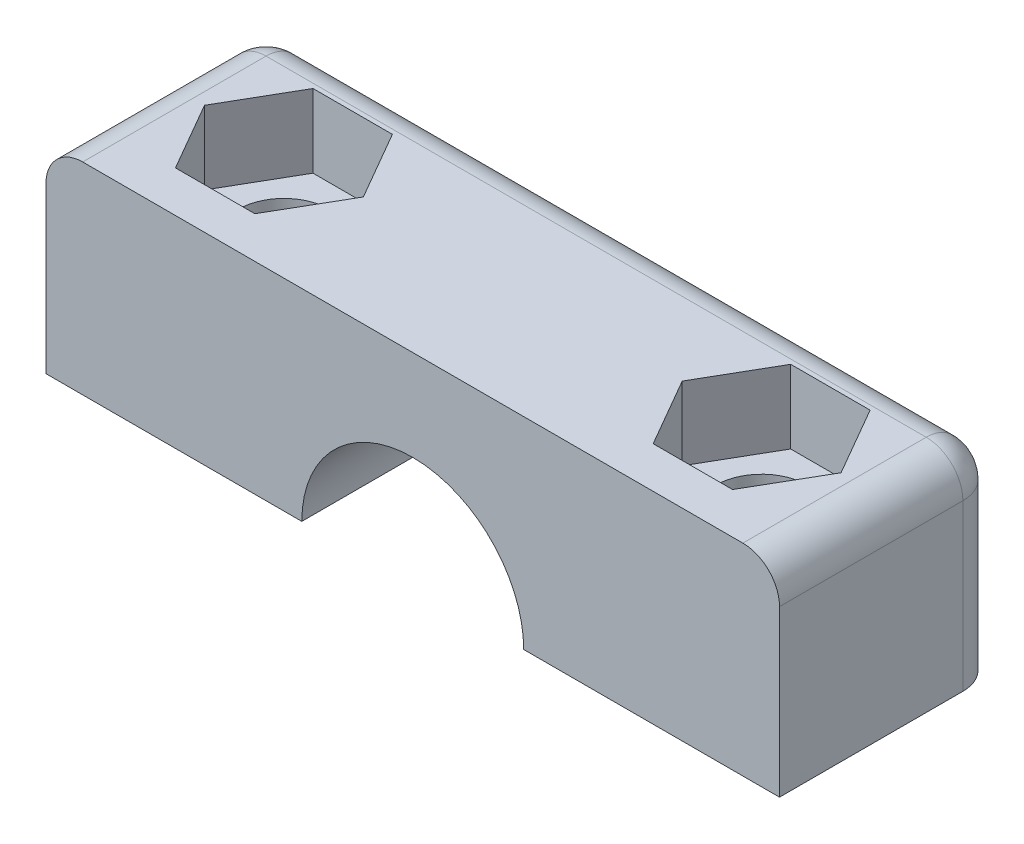
ISO-10303-21;
HEADER;
FILE_DESCRIPTION(('STEP AP214'),'2;1');
FILE_NAME('part.step','',(''),(''),'','','');
FILE_SCHEMA(('AUTOMOTIVE_DESIGN { 1 0 10303 214 1 1 1 1 }'));
ENDSEC;
DATA;
#1=APPLICATION_CONTEXT('core data for automotive mechanical design processes');
#2=APPLICATION_PROTOCOL_DEFINITION('international standard','automotive_design',2000,#1);
#3=PRODUCT_CONTEXT('',#1,'mechanical');
#4=PRODUCT('Part','Part','',(#3));
#5=PRODUCT_RELATED_PRODUCT_CATEGORY('part','',(#4));
#6=PRODUCT_DEFINITION_FORMATION('','',#4);
#7=PRODUCT_DEFINITION_CONTEXT('part definition',#1,'design');
#8=PRODUCT_DEFINITION('design','',#6,#7);
#9=PRODUCT_DEFINITION_SHAPE('','',#8);
#10=(LENGTH_UNIT() NAMED_UNIT(*) SI_UNIT(.MILLI.,.METRE.));
#11=(NAMED_UNIT(*) PLANE_ANGLE_UNIT() SI_UNIT($,.RADIAN.));
#12=(NAMED_UNIT(*) SI_UNIT($,.STERADIAN.) SOLID_ANGLE_UNIT());
#13=UNCERTAINTY_MEASURE_WITH_UNIT(LENGTH_MEASURE(1.E-05),#10,'distance_accuracy_value','');
#14=(GEOMETRIC_REPRESENTATION_CONTEXT(3) GLOBAL_UNCERTAINTY_ASSIGNED_CONTEXT((#13)) GLOBAL_UNIT_ASSIGNED_CONTEXT((#10,
#11,#12)) REPRESENTATION_CONTEXT('',''));
#15=CARTESIAN_POINT('',(0.,0.,0.));
#16=DIRECTION('',(0.,0.,1.));
#17=DIRECTION('',(1.,0.,0.));
#18=AXIS2_PLACEMENT_3D('',#15,#16,#17);
#19=CARTESIAN_POINT('',(16.2106127574377,9.72584856396867,6.));
#20=DIRECTION('',(0.,-1.,0.));
#21=DIRECTION('',(0.,0.,-1.));
#22=AXIS2_PLACEMENT_3D('',#19,#20,#21);
#23=CYLINDRICAL_SURFACE('',#22,2.5);
#24=CARTESIAN_POINT('',(16.2106127574377,-18.2741514360313,6.));
#25=DIRECTION('',(0.,-1.,0.));
#26=DIRECTION('',(0.,0.,-1.));
#27=AXIS2_PLACEMENT_3D('',#24,#25,#26);
#28=CIRCLE('',#27,2.5);
#29=CARTESIAN_POINT('',(16.2106127574377,-18.2741514360313,3.5));
#30=VERTEX_POINT('',#29);
#31=EDGE_CURVE('E289',#30,#30,#28,.T.);
#32=CARTESIAN_POINT('',(16.2106127574377,-11.2741514360313,6.));
#33=DIRECTION('',(0.,1.,0.));
#34=DIRECTION('',(0.,0.,1.));
#35=AXIS2_PLACEMENT_3D('',#32,#33,#34);
#36=CIRCLE('',#35,2.5);
#37=CARTESIAN_POINT('',(16.2106127574377,-11.2741514360313,3.5));
#38=VERTEX_POINT('',#37);
#39=EDGE_CURVE('E38',#38,#38,#36,.F.);
#40=CARTESIAN_POINT('',(16.2106127574377,-18.2741514360313,3.5));
#41=CARTESIAN_POINT('',(16.2106127574377,-18.2012347693647,3.5));
#42=CARTESIAN_POINT('',(16.2106127574377,-18.128318102698,3.5));
#43=CARTESIAN_POINT('',(16.2106127574377,-17.9824847693647,3.5));
#44=CARTESIAN_POINT('',(16.2106127574377,-17.909568102698,3.5));
#45=CARTESIAN_POINT('',(16.2106127574377,-17.7637347693647,3.5));
#46=CARTESIAN_POINT('',(16.2106127574377,-17.690818102698,3.5));
#47=CARTESIAN_POINT('',(16.2106127574377,-17.5449847693647,3.5));
#48=CARTESIAN_POINT('',(16.2106127574377,-17.472068102698,3.5));
#49=CARTESIAN_POINT('',(16.2106127574377,-17.3262347693647,3.5));
#50=CARTESIAN_POINT('',(16.2106127574377,-17.253318102698,3.5));
#51=CARTESIAN_POINT('',(16.2106127574377,-17.1074847693647,3.5));
#52=CARTESIAN_POINT('',(16.2106127574377,-17.034568102698,3.5));
#53=CARTESIAN_POINT('',(16.2106127574377,-16.8887347693647,3.5));
#54=CARTESIAN_POINT('',(16.2106127574377,-16.815818102698,3.5));
#55=CARTESIAN_POINT('',(16.2106127574377,-16.6699847693647,3.5));
#56=CARTESIAN_POINT('',(16.2106127574377,-16.597068102698,3.5));
#57=CARTESIAN_POINT('',(16.2106127574377,-16.4512347693647,3.5));
#58=CARTESIAN_POINT('',(16.2106127574377,-16.378318102698,3.5));
#59=CARTESIAN_POINT('',(16.2106127574377,-16.2324847693647,3.5));
#60=CARTESIAN_POINT('',(16.2106127574377,-16.159568102698,3.5));
#61=CARTESIAN_POINT('',(16.2106127574377,-16.0137347693647,3.5));
#62=CARTESIAN_POINT('',(16.2106127574377,-15.940818102698,3.5));
#63=CARTESIAN_POINT('',(16.2106127574377,-15.7949847693647,3.5));
#64=CARTESIAN_POINT('',(16.2106127574377,-15.722068102698,3.5));
#65=CARTESIAN_POINT('',(16.2106127574377,-15.5762347693647,3.5));
#66=CARTESIAN_POINT('',(16.2106127574377,-15.503318102698,3.5));
#67=CARTESIAN_POINT('',(16.2106127574377,-15.3574847693647,3.5));
#68=CARTESIAN_POINT('',(16.2106127574377,-15.284568102698,3.5));
#69=CARTESIAN_POINT('',(16.2106127574377,-15.1387347693647,3.5));
#70=CARTESIAN_POINT('',(16.2106127574377,-15.065818102698,3.5));
#71=CARTESIAN_POINT('',(16.2106127574377,-14.9199847693647,3.5));
#72=CARTESIAN_POINT('',(16.2106127574377,-14.847068102698,3.5));
#73=CARTESIAN_POINT('',(16.2106127574377,-14.7012347693647,3.5));
#74=CARTESIAN_POINT('',(16.2106127574377,-14.628318102698,3.5));
#75=CARTESIAN_POINT('',(16.2106127574377,-14.4824847693647,3.5));
#76=CARTESIAN_POINT('',(16.2106127574377,-14.409568102698,3.5));
#77=CARTESIAN_POINT('',(16.2106127574377,-14.2637347693647,3.5));
#78=CARTESIAN_POINT('',(16.2106127574377,-14.190818102698,3.5));
#79=CARTESIAN_POINT('',(16.2106127574377,-14.0449847693647,3.5));
#80=CARTESIAN_POINT('',(16.2106127574377,-13.972068102698,3.5));
#81=CARTESIAN_POINT('',(16.2106127574377,-13.8262347693647,3.5));
#82=CARTESIAN_POINT('',(16.2106127574377,-13.753318102698,3.5));
#83=CARTESIAN_POINT('',(16.2106127574377,-13.6074847693647,3.5));
#84=CARTESIAN_POINT('',(16.2106127574377,-13.534568102698,3.5));
#85=CARTESIAN_POINT('',(16.2106127574377,-13.3887347693647,3.5));
#86=CARTESIAN_POINT('',(16.2106127574377,-13.315818102698,3.5));
#87=CARTESIAN_POINT('',(16.2106127574377,-13.1699847693647,3.5));
#88=CARTESIAN_POINT('',(16.2106127574377,-13.097068102698,3.5));
#89=CARTESIAN_POINT('',(16.2106127574377,-12.9512347693647,3.5));
#90=CARTESIAN_POINT('',(16.2106127574377,-12.878318102698,3.5));
#91=CARTESIAN_POINT('',(16.2106127574377,-12.7324847693647,3.5));
#92=CARTESIAN_POINT('',(16.2106127574377,-12.659568102698,3.5));
#93=CARTESIAN_POINT('',(16.2106127574377,-12.5137347693647,3.5));
#94=CARTESIAN_POINT('',(16.2106127574377,-12.440818102698,3.5));
#95=CARTESIAN_POINT('',(16.2106127574377,-12.2949847693647,3.5));
#96=CARTESIAN_POINT('',(16.2106127574377,-12.222068102698,3.5));
#97=CARTESIAN_POINT('',(16.2106127574377,-12.0762347693647,3.5));
#98=CARTESIAN_POINT('',(16.2106127574377,-12.003318102698,3.5));
#99=CARTESIAN_POINT('',(16.2106127574377,-11.8574847693647,3.5));
#100=CARTESIAN_POINT('',(16.2106127574377,-11.784568102698,3.5));
#101=CARTESIAN_POINT('',(16.2106127574377,-11.6387347693647,3.5));
#102=CARTESIAN_POINT('',(16.2106127574377,-11.565818102698,3.5));
#103=CARTESIAN_POINT('',(16.2106127574377,-11.4199847693647,3.5));
#104=CARTESIAN_POINT('',(16.2106127574377,-11.347068102698,3.5));
#105=CARTESIAN_POINT('',(16.2106127574377,-11.2741514360313,3.5));
#106=B_SPLINE_CURVE_WITH_KNOTS('',3,(#40,#41,#42,#43,#44,#45,#46,#47,#48,#49,#50,#51,#52,#53,
#54,#55,#56,#57,#58,#59,#60,#61,#62,#63,#64,#65,#66,#67,#68,#69,#70,#71,#72,#73,#74,#75,#76,#77,
#78,#79,#80,#81,#82,#83,#84,#85,#86,#87,#88,#89,#90,#91,#92,#93,#94,#95,#96,#97,#98,#99,#100,
#101,#102,#103,#104,#105),.UNSPECIFIED.,.F.,.F.,(4,2,2,2,2,2,2,2,2,2,2,2,2,2,2,2,2,2,2,2,2,2,2,
2,2,2,2,2,2,2,2,2,4),(0.,0.21875,0.4375,0.656250000000001,0.875000000000001,1.09375,1.3125,
1.53125,1.75,1.96875,2.1875,2.40625,2.625,2.84375,3.0625,3.28125,3.5,3.71875,3.9375,
4.15624999999999,4.375,4.59374999999999,4.81249999999999,5.03124999999999,5.24999999999999,
5.46874999999999,5.68749999999999,5.90624999999999,6.12499999999999,6.34375,6.56249999999999,
6.78124999999999,6.99999999999999),.UNSPECIFIED.);
#107=EDGE_CURVE('BSEAM34',#30,#38,#106,.T.);
#108=ORIENTED_EDGE('',*,*,#31,.T.);
#109=ORIENTED_EDGE('',*,*,#39,.F.);
#110=ORIENTED_EDGE('',*,*,#107,.T.);
#111=ORIENTED_EDGE('',*,*,#107,.F.);
#112=EDGE_LOOP('',(#108,#110,#109,#111));
#113=FACE_BOUND('',#112,.T.);
#114=ADVANCED_FACE('F34',(#113),#23,.F.);
#115=CARTESIAN_POINT('',(-9.83938724256228,9.72584856396867,6.));
#116=DIRECTION('',(0.,-1.,0.));
#117=DIRECTION('',(0.,0.,-1.));
#118=AXIS2_PLACEMENT_3D('',#115,#116,#117);
#119=CYLINDRICAL_SURFACE('',#118,2.5);
#120=CARTESIAN_POINT('',(-9.83938724256228,-18.2741514360313,6.));
#121=DIRECTION('',(0.,-1.,0.));
#122=DIRECTION('',(0.,0.,-1.));
#123=AXIS2_PLACEMENT_3D('',#120,#121,#122);
#124=CIRCLE('',#123,2.5);
#125=CARTESIAN_POINT('',(-9.83938724256228,-18.2741514360313,3.5));
#126=VERTEX_POINT('',#125);
#127=EDGE_CURVE('E293',#126,#126,#124,.T.);
#128=CARTESIAN_POINT('',(-9.83938724256228,-11.2741514360313,6.));
#129=DIRECTION('',(0.,1.,0.));
#130=DIRECTION('',(0.,0.,1.));
#131=AXIS2_PLACEMENT_3D('',#128,#129,#130);
#132=CIRCLE('',#131,2.5);
#133=CARTESIAN_POINT('',(-9.83938724256228,-11.2741514360313,3.5));
#134=VERTEX_POINT('',#133);
#135=EDGE_CURVE('E276',#134,#134,#132,.F.);
#136=CARTESIAN_POINT('',(-9.83938724256228,-18.2741514360313,3.5));
#137=CARTESIAN_POINT('',(-9.83938724256228,-18.2012347693647,3.5));
#138=CARTESIAN_POINT('',(-9.83938724256228,-18.128318102698,3.5));
#139=CARTESIAN_POINT('',(-9.83938724256228,-17.9824847693647,3.5));
#140=CARTESIAN_POINT('',(-9.83938724256228,-17.909568102698,3.5));
#141=CARTESIAN_POINT('',(-9.83938724256228,-17.7637347693647,3.5));
#142=CARTESIAN_POINT('',(-9.83938724256228,-17.690818102698,3.5));
#143=CARTESIAN_POINT('',(-9.83938724256228,-17.5449847693647,3.5));
#144=CARTESIAN_POINT('',(-9.83938724256228,-17.472068102698,3.5));
#145=CARTESIAN_POINT('',(-9.83938724256228,-17.3262347693647,3.5));
#146=CARTESIAN_POINT('',(-9.83938724256228,-17.253318102698,3.5));
#147=CARTESIAN_POINT('',(-9.83938724256228,-17.1074847693647,3.5));
#148=CARTESIAN_POINT('',(-9.83938724256228,-17.034568102698,3.5));
#149=CARTESIAN_POINT('',(-9.83938724256228,-16.8887347693647,3.5));
#150=CARTESIAN_POINT('',(-9.83938724256228,-16.815818102698,3.5));
#151=CARTESIAN_POINT('',(-9.83938724256228,-16.6699847693647,3.5));
#152=CARTESIAN_POINT('',(-9.83938724256228,-16.597068102698,3.5));
#153=CARTESIAN_POINT('',(-9.83938724256228,-16.4512347693647,3.5));
#154=CARTESIAN_POINT('',(-9.83938724256228,-16.378318102698,3.5));
#155=CARTESIAN_POINT('',(-9.83938724256228,-16.2324847693647,3.5));
#156=CARTESIAN_POINT('',(-9.83938724256228,-16.159568102698,3.5));
#157=CARTESIAN_POINT('',(-9.83938724256228,-16.0137347693647,3.5));
#158=CARTESIAN_POINT('',(-9.83938724256228,-15.940818102698,3.5));
#159=CARTESIAN_POINT('',(-9.83938724256228,-15.7949847693647,3.5));
#160=CARTESIAN_POINT('',(-9.83938724256228,-15.722068102698,3.5));
#161=CARTESIAN_POINT('',(-9.83938724256228,-15.5762347693647,3.5));
#162=CARTESIAN_POINT('',(-9.83938724256228,-15.503318102698,3.5));
#163=CARTESIAN_POINT('',(-9.83938724256228,-15.3574847693647,3.5));
#164=CARTESIAN_POINT('',(-9.83938724256228,-15.284568102698,3.5));
#165=CARTESIAN_POINT('',(-9.83938724256228,-15.1387347693647,3.5));
#166=CARTESIAN_POINT('',(-9.83938724256228,-15.065818102698,3.5));
#167=CARTESIAN_POINT('',(-9.83938724256228,-14.9199847693647,3.5));
#168=CARTESIAN_POINT('',(-9.83938724256228,-14.847068102698,3.5));
#169=CARTESIAN_POINT('',(-9.83938724256228,-14.7012347693647,3.5));
#170=CARTESIAN_POINT('',(-9.83938724256228,-14.628318102698,3.5));
#171=CARTESIAN_POINT('',(-9.83938724256228,-14.4824847693647,3.5));
#172=CARTESIAN_POINT('',(-9.83938724256228,-14.409568102698,3.5));
#173=CARTESIAN_POINT('',(-9.83938724256228,-14.2637347693647,3.5));
#174=CARTESIAN_POINT('',(-9.83938724256228,-14.190818102698,3.5));
#175=CARTESIAN_POINT('',(-9.83938724256228,-14.0449847693647,3.5));
#176=CARTESIAN_POINT('',(-9.83938724256228,-13.972068102698,3.5));
#177=CARTESIAN_POINT('',(-9.83938724256228,-13.8262347693647,3.5));
#178=CARTESIAN_POINT('',(-9.83938724256228,-13.753318102698,3.5));
#179=CARTESIAN_POINT('',(-9.83938724256228,-13.6074847693647,3.5));
#180=CARTESIAN_POINT('',(-9.83938724256228,-13.534568102698,3.5));
#181=CARTESIAN_POINT('',(-9.83938724256228,-13.3887347693647,3.5));
#182=CARTESIAN_POINT('',(-9.83938724256228,-13.315818102698,3.5));
#183=CARTESIAN_POINT('',(-9.83938724256228,-13.1699847693647,3.5));
#184=CARTESIAN_POINT('',(-9.83938724256228,-13.097068102698,3.5));
#185=CARTESIAN_POINT('',(-9.83938724256228,-12.9512347693647,3.5));
#186=CARTESIAN_POINT('',(-9.83938724256228,-12.878318102698,3.5));
#187=CARTESIAN_POINT('',(-9.83938724256228,-12.7324847693647,3.5));
#188=CARTESIAN_POINT('',(-9.83938724256228,-12.659568102698,3.5));
#189=CARTESIAN_POINT('',(-9.83938724256228,-12.5137347693647,3.5));
#190=CARTESIAN_POINT('',(-9.83938724256228,-12.440818102698,3.5));
#191=CARTESIAN_POINT('',(-9.83938724256228,-12.2949847693647,3.5));
#192=CARTESIAN_POINT('',(-9.83938724256228,-12.222068102698,3.5));
#193=CARTESIAN_POINT('',(-9.83938724256228,-12.0762347693647,3.5));
#194=CARTESIAN_POINT('',(-9.83938724256228,-12.003318102698,3.5));
#195=CARTESIAN_POINT('',(-9.83938724256228,-11.8574847693647,3.5));
#196=CARTESIAN_POINT('',(-9.83938724256228,-11.784568102698,3.5));
#197=CARTESIAN_POINT('',(-9.83938724256228,-11.6387347693647,3.5));
#198=CARTESIAN_POINT('',(-9.83938724256228,-11.565818102698,3.5));
#199=CARTESIAN_POINT('',(-9.83938724256228,-11.4199847693647,3.5));
#200=CARTESIAN_POINT('',(-9.83938724256228,-11.347068102698,3.5));
#201=CARTESIAN_POINT('',(-9.83938724256228,-11.2741514360313,3.5));
#202=B_SPLINE_CURVE_WITH_KNOTS('',3,(#136,#137,#138,#139,#140,#141,#142,#143,#144,#145,#146,
#147,#148,#149,#150,#151,#152,#153,#154,#155,#156,#157,#158,#159,#160,#161,#162,#163,#164,#165,
#166,#167,#168,#169,#170,#171,#172,#173,#174,#175,#176,#177,#178,#179,#180,#181,#182,#183,#184,
#185,#186,#187,#188,#189,#190,#191,#192,#193,#194,#195,#196,#197,#198,#199,#200,#201),
.UNSPECIFIED.,.F.,.F.,(4,2,2,2,2,2,2,2,2,2,2,2,2,2,2,2,2,2,2,2,2,2,2,2,2,2,2,2,2,2,2,2,4),(0.,
0.21875,0.4375,0.656250000000001,0.875000000000001,1.09375,1.3125,1.53125,1.75,1.96875,2.1875,
2.40625,2.625,2.84375,3.0625,3.28125,3.5,3.71875,3.9375,4.15624999999999,4.375,4.59374999999999,
4.81249999999999,5.03124999999999,5.24999999999999,5.46874999999999,5.68749999999999,
5.90624999999999,6.12499999999999,6.34375,6.56249999999999,6.78124999999999,6.99999999999999),.UNSPECIFIED.);
#203=EDGE_CURVE('BSEAM370',#126,#134,#202,.T.);
#204=ORIENTED_EDGE('',*,*,#127,.T.);
#205=ORIENTED_EDGE('',*,*,#135,.F.);
#206=ORIENTED_EDGE('',*,*,#203,.T.);
#207=ORIENTED_EDGE('',*,*,#203,.F.);
#208=EDGE_LOOP('',(#204,#206,#205,#207));
#209=FACE_BOUND('',#208,.T.);
#210=ADVANCED_FACE('F370',(#209),#119,.F.);
#211=CARTESIAN_POINT('',(0.,-18.2741514360313,0.));
#212=DIRECTION('',(0.,-1.,0.));
#213=DIRECTION('',(0.,0.,-1.));
#214=AXIS2_PLACEMENT_3D('',#211,#212,#213);
#215=PLANE('',#214);
#216=ORIENTED_EDGE('',*,*,#31,.F.);
#217=EDGE_LOOP('',(#216));
#218=FACE_BOUND('',#217,.T.);
#219=DIRECTION('',(1.,0.,0.));
#220=VECTOR('',#219,1.);
#221=CARTESIAN_POINT('',(23.1856127574377,-18.2741514360313,0.));
#222=LINE('',#221,#220);
#223=CARTESIAN_POINT('',(9.23561275743771,-18.2741514360313,0.));
#224=VERTEX_POINT('',#223);
#225=CARTESIAN_POINT('',(21.1856127574377,-18.2741514360313,0.));
#226=VERTEX_POINT('',#225);
#227=EDGE_CURVE('E315',#224,#226,#222,.T.);
#228=ORIENTED_EDGE('',*,*,#227,.T.);
#229=CARTESIAN_POINT('',(21.1856127574377,-18.2741514360313,2.));
#230=DIRECTION('',(0.,-1.,0.));
#231=DIRECTION('',(0.,0.,-1.));
#232=AXIS2_PLACEMENT_3D('',#229,#230,#231);
#233=CIRCLE('',#232,2.);
#234=CARTESIAN_POINT('',(23.1856127574377,-18.2741514360313,2.));
#235=VERTEX_POINT('',#234);
#236=EDGE_CURVE('E335',#226,#235,#233,.T.);
#237=ORIENTED_EDGE('',*,*,#236,.T.);
#238=DIRECTION('',(0.,0.,1.));
#239=VECTOR('',#238,1.);
#240=CARTESIAN_POINT('',(23.1856127574377,-18.2741514360313,0.));
#241=LINE('',#240,#239);
#242=CARTESIAN_POINT('',(23.1856127574377,-18.2741514360313,12.));
#243=VERTEX_POINT('',#242);
#244=EDGE_CURVE('E304',#235,#243,#241,.T.);
#245=ORIENTED_EDGE('',*,*,#244,.T.);
#246=DIRECTION('',(-1.,0.,0.));
#247=VECTOR('',#246,1.);
#248=CARTESIAN_POINT('',(23.1856127574377,-18.2741514360313,12.));
#249=LINE('',#248,#247);
#250=CARTESIAN_POINT('',(9.23561275743771,-18.2741514360313,12.));
#251=VERTEX_POINT('',#250);
#252=EDGE_CURVE('E309',#243,#251,#249,.T.);
#253=ORIENTED_EDGE('',*,*,#252,.T.);
#254=DIRECTION('',(0.,0.,1.));
#255=VECTOR('',#254,1.);
#256=CARTESIAN_POINT('',(9.23561275743771,-18.2741514360313,0.));
#257=LINE('',#256,#255);
#258=EDGE_CURVE('E302',#224,#251,#257,.T.);
#259=ORIENTED_EDGE('',*,*,#258,.F.);
#260=EDGE_LOOP('',(#228,#237,#245,#253,#259));
#261=FACE_BOUND('',#260,.T.);
#262=ADVANCED_FACE('F372',(#218,#261),#215,.T.);
#263=CARTESIAN_POINT('',(-16.8143872425623,9.72584856396867,12.));
#264=DIRECTION('',(1.,0.,0.));
#265=DIRECTION('',(0.,1.,0.));
#266=AXIS2_PLACEMENT_3D('',#263,#264,#265);
#267=PLANE('',#266);
#268=DIRECTION('',(0.,-1.,0.));
#269=VECTOR('',#268,1.);
#270=CARTESIAN_POINT('',(-16.8143872425623,9.72584856396867,12.));
#271=LINE('',#270,#269);
#272=CARTESIAN_POINT('',(-16.8143872425623,-9.27415143603132,12.));
#273=VERTEX_POINT('',#272);
#274=CARTESIAN_POINT('',(-16.8143872425623,-18.2741514360313,12.));
#275=VERTEX_POINT('',#274);
#276=EDGE_CURVE('E318',#273,#275,#271,.T.);
#277=ORIENTED_EDGE('',*,*,#276,.F.);
#278=DIRECTION('',(0.,0.,-1.));
#279=VECTOR('',#278,1.);
#280=CARTESIAN_POINT('',(-16.8143872425623,-9.27415143603132,12.));
#281=LINE('',#280,#279);
#282=CARTESIAN_POINT('',(-16.8143872425623,-9.27415143603132,2.));
#283=VERTEX_POINT('',#282);
#284=EDGE_CURVE('E352',#273,#283,#281,.T.);
#285=ORIENTED_EDGE('',*,*,#284,.T.);
#286=DIRECTION('',(0.,-1.,0.));
#287=VECTOR('',#286,1.);
#288=CARTESIAN_POINT('',(-16.8143872425623,9.72584856396867,2.));
#289=LINE('',#288,#287);
#290=CARTESIAN_POINT('',(-16.8143872425623,-18.2741514360313,2.));
#291=VERTEX_POINT('',#290);
#292=EDGE_CURVE('E323',#283,#291,#289,.T.);
#293=ORIENTED_EDGE('',*,*,#292,.T.);
#294=DIRECTION('',(0.,0.,-1.));
#295=VECTOR('',#294,1.);
#296=CARTESIAN_POINT('',(-16.8143872425623,-18.2741514360313,0.));
#297=LINE('',#296,#295);
#298=EDGE_CURVE('E312',#275,#291,#297,.T.);
#299=ORIENTED_EDGE('',*,*,#298,.F.);
#300=EDGE_LOOP('',(#277,#285,#293,#299));
#301=FACE_BOUND('',#300,.T.);
#302=ADVANCED_FACE('F379',(#301),#267,.F.);
#303=CARTESIAN_POINT('',(23.1856127574377,9.72584856396867,12.));
#304=DIRECTION('',(-1.,0.,0.));
#305=DIRECTION('',(0.,0.,1.));
#306=AXIS2_PLACEMENT_3D('',#303,#304,#305);
#307=PLANE('',#306);
#308=DIRECTION('',(0.,1.,0.));
#309=VECTOR('',#308,1.);
#310=CARTESIAN_POINT('',(23.1856127574377,9.72584856396867,2.));
#311=LINE('',#310,#309);
#312=CARTESIAN_POINT('',(23.1856127574377,-9.27415143603132,2.));
#313=VERTEX_POINT('',#312);
#314=EDGE_CURVE('E332',#235,#313,#311,.T.);
#315=ORIENTED_EDGE('',*,*,#314,.T.);
#316=DIRECTION('',(0.,0.,1.));
#317=VECTOR('',#316,1.);
#318=CARTESIAN_POINT('',(23.1856127574377,-9.27415143603132,12.));
#319=LINE('',#318,#317);
#320=CARTESIAN_POINT('',(23.1856127574377,-9.27415143603132,12.));
#321=VERTEX_POINT('',#320);
#322=EDGE_CURVE('E337',#313,#321,#319,.T.);
#323=ORIENTED_EDGE('',*,*,#322,.T.);
#324=DIRECTION('',(0.,1.,0.));
#325=VECTOR('',#324,1.);
#326=CARTESIAN_POINT('',(23.1856127574377,9.72584856396867,12.));
#327=LINE('',#326,#325);
#328=EDGE_CURVE('E320',#243,#321,#327,.T.);
#329=ORIENTED_EDGE('',*,*,#328,.F.);
#330=ORIENTED_EDGE('',*,*,#244,.F.);
#331=EDGE_LOOP('',(#315,#323,#329,#330));
#332=FACE_BOUND('',#331,.T.);
#333=ADVANCED_FACE('F398',(#332),#307,.F.);
#334=CARTESIAN_POINT('',(0.,0.,12.));
#335=DIRECTION('',(0.,0.,1.));
#336=DIRECTION('',(1.,0.,0.));
#337=AXIS2_PLACEMENT_3D('',#334,#335,#336);
#338=PLANE('',#337);
#339=ORIENTED_EDGE('',*,*,#328,.T.);
#340=CARTESIAN_POINT('',(21.1856127574377,-9.27415143603132,12.));
#341=DIRECTION('',(0.,0.,1.));
#342=DIRECTION('',(1.,0.,0.));
#343=AXIS2_PLACEMENT_3D('',#340,#341,#342);
#344=CIRCLE('',#343,2.);
#345=CARTESIAN_POINT('',(21.1856127574377,-7.27415143603133,12.));
#346=VERTEX_POINT('',#345);
#347=EDGE_CURVE('E342',#321,#346,#344,.T.);
#348=ORIENTED_EDGE('',*,*,#347,.T.);
#349=DIRECTION('',(-1.,0.,0.));
#350=VECTOR('',#349,1.);
#351=CARTESIAN_POINT('',(38.6194564297195,-7.27415143603133,12.));
#352=LINE('',#351,#350);
#353=CARTESIAN_POINT('',(-14.8143872425623,-7.27415143603133,12.));
#354=VERTEX_POINT('',#353);
#355=EDGE_CURVE('E286',#346,#354,#352,.T.);
#356=ORIENTED_EDGE('',*,*,#355,.T.);
#357=CARTESIAN_POINT('',(-14.8143872425623,-9.27415143603132,12.));
#358=DIRECTION('',(0.,0.,1.));
#359=DIRECTION('',(1.,0.,0.));
#360=AXIS2_PLACEMENT_3D('',#357,#358,#359);
#361=CIRCLE('',#360,2.);
#362=EDGE_CURVE('E340',#354,#273,#361,.T.);
#363=ORIENTED_EDGE('',*,*,#362,.T.);
#364=ORIENTED_EDGE('',*,*,#276,.T.);
#365=CARTESIAN_POINT('',(-2.86438724256229,-18.2741514360313,12.));
#366=VERTEX_POINT('',#365);
#367=EDGE_CURVE('E308',#366,#275,#249,.T.);
#368=ORIENTED_EDGE('',*,*,#367,.F.);
#369=CARTESIAN_POINT('',(3.18561275743771,-18.2741514360313,12.));
#370=DIRECTION('',(0.,0.,1.));
#371=DIRECTION('',(-1.,0.,0.));
#372=AXIS2_PLACEMENT_3D('',#369,#370,#371);
#373=CIRCLE('',#372,6.05);
#374=EDGE_CURVE('E296',#251,#366,#373,.T.);
#375=ORIENTED_EDGE('',*,*,#374,.F.);
#376=ORIENTED_EDGE('',*,*,#252,.F.);
#377=EDGE_LOOP('',(#339,#348,#356,#363,#364,#368,#375,#376));
#378=FACE_BOUND('',#377,.T.);
#379=ADVANCED_FACE('F395',(#378),#338,.T.);
#380=CARTESIAN_POINT('',(0.,0.,0.));
#381=DIRECTION('',(0.,0.,1.));
#382=DIRECTION('',(1.,0.,0.));
#383=AXIS2_PLACEMENT_3D('',#380,#381,#382);
#384=PLANE('',#383);
#385=DIRECTION('',(0.,-1.,0.));
#386=VECTOR('',#385,1.);
#387=CARTESIAN_POINT('',(-14.8143872425623,0.,0.));
#388=LINE('',#387,#386);
#389=CARTESIAN_POINT('',(-14.8143872425623,-18.2741514360313,0.));
#390=VERTEX_POINT('',#389);
#391=CARTESIAN_POINT('',(-14.8143872425623,-9.27415143603132,0.));
#392=VERTEX_POINT('',#391);
#393=EDGE_CURVE('E329',#390,#392,#388,.F.);
#394=ORIENTED_EDGE('',*,*,#393,.T.);
#395=DIRECTION('',(-1.,0.,0.));
#396=VECTOR('',#395,1.);
#397=CARTESIAN_POINT('',(0.,-9.27415143603132,0.));
#398=LINE('',#397,#396);
#399=CARTESIAN_POINT('',(21.1856127574377,-9.27415143603132,0.));
#400=VERTEX_POINT('',#399);
#401=EDGE_CURVE('E11',#392,#400,#398,.F.);
#402=ORIENTED_EDGE('',*,*,#401,.T.);
#403=DIRECTION('',(0.,1.,0.));
#404=VECTOR('',#403,1.);
#405=CARTESIAN_POINT('',(21.1856127574377,0.,0.));
#406=LINE('',#405,#404);
#407=EDGE_CURVE('E327',#400,#226,#406,.F.);
#408=ORIENTED_EDGE('',*,*,#407,.T.);
#409=ORIENTED_EDGE('',*,*,#227,.F.);
#410=CARTESIAN_POINT('',(3.18561275743771,-18.2741514360313,0.));
#411=DIRECTION('',(0.,0.,1.));
#412=DIRECTION('',(-1.,0.,0.));
#413=AXIS2_PLACEMENT_3D('',#410,#411,#412);
#414=CIRCLE('',#413,6.05);
#415=CARTESIAN_POINT('',(-2.86438724256229,-18.2741514360313,0.));
#416=VERTEX_POINT('',#415);
#417=EDGE_CURVE('E297',#224,#416,#414,.T.);
#418=ORIENTED_EDGE('',*,*,#417,.T.);
#419=EDGE_CURVE('E316',#390,#416,#222,.T.);
#420=ORIENTED_EDGE('',*,*,#419,.F.);
#421=EDGE_LOOP('',(#394,#402,#408,#409,#418,#420));
#422=FACE_BOUND('',#421,.T.);
#423=ADVANCED_FACE('F393',(#422),#384,.F.);
#424=ORIENTED_EDGE('',*,*,#127,.F.);
#425=EDGE_LOOP('',(#424));
#426=FACE_BOUND('',#425,.T.);
#427=ORIENTED_EDGE('',*,*,#298,.T.);
#428=CARTESIAN_POINT('',(-14.8143872425623,-18.2741514360313,2.));
#429=DIRECTION('',(0.,-1.,0.));
#430=DIRECTION('',(0.,0.,-1.));
#431=AXIS2_PLACEMENT_3D('',#428,#429,#430);
#432=CIRCLE('',#431,2.);
#433=EDGE_CURVE('E325',#291,#390,#432,.T.);
#434=ORIENTED_EDGE('',*,*,#433,.T.);
#435=ORIENTED_EDGE('',*,*,#419,.T.);
#436=DIRECTION('',(0.,0.,1.));
#437=VECTOR('',#436,1.);
#438=CARTESIAN_POINT('',(-2.86438724256229,-18.2741514360313,0.));
#439=LINE('',#438,#437);
#440=EDGE_CURVE('E300',#416,#366,#439,.T.);
#441=ORIENTED_EDGE('',*,*,#440,.T.);
#442=ORIENTED_EDGE('',*,*,#367,.T.);
#443=EDGE_LOOP('',(#427,#434,#435,#441,#442));
#444=FACE_BOUND('',#443,.T.);
#445=ADVANCED_FACE('F382',(#426,#444),#215,.T.);
#446=CARTESIAN_POINT('',(3.18561275743771,-18.2741514360313,0.));
#447=DIRECTION('',(0.,0.,1.));
#448=DIRECTION('',(1.,0.,0.));
#449=AXIS2_PLACEMENT_3D('',#446,#447,#448);
#450=CYLINDRICAL_SURFACE('',#449,6.05);
#451=ORIENTED_EDGE('',*,*,#374,.T.);
#452=ORIENTED_EDGE('',*,*,#440,.F.);
#453=ORIENTED_EDGE('',*,*,#417,.F.);
#454=ORIENTED_EDGE('',*,*,#258,.T.);
#455=EDGE_LOOP('',(#451,#452,#453,#454));
#456=FACE_BOUND('',#455,.T.);
#457=ADVANCED_FACE('F387',(#456),#450,.F.);
#458=CARTESIAN_POINT('',(21.1856127574377,9.72584856396867,2.));
#459=DIRECTION('',(0.,1.,0.));
#460=DIRECTION('',(0.,0.,1.));
#461=AXIS2_PLACEMENT_3D('',#458,#459,#460);
#462=CYLINDRICAL_SURFACE('',#461,2.);
#463=ORIENTED_EDGE('',*,*,#407,.F.);
#464=CARTESIAN_POINT('',(21.1856127574377,-9.27415143603132,2.));
#465=DIRECTION('',(0.,1.,0.));
#466=DIRECTION('',(0.,0.,1.));
#467=AXIS2_PLACEMENT_3D('',#464,#465,#466);
#468=CIRCLE('',#467,2.);
#469=EDGE_CURVE('E350',#400,#313,#468,.F.);
#470=ORIENTED_EDGE('',*,*,#469,.T.);
#471=ORIENTED_EDGE('',*,*,#314,.F.);
#472=ORIENTED_EDGE('',*,*,#236,.F.);
#473=EDGE_LOOP('',(#463,#470,#471,#472));
#474=FACE_BOUND('',#473,.T.);
#475=ADVANCED_FACE('F389',(#474),#462,.T.);
#476=CARTESIAN_POINT('',(-14.8143872425623,9.72584856396867,2.));
#477=DIRECTION('',(0.,-1.,0.));
#478=DIRECTION('',(1.,0.,0.));
#479=AXIS2_PLACEMENT_3D('',#476,#477,#478);
#480=CYLINDRICAL_SURFACE('',#479,2.);
#481=ORIENTED_EDGE('',*,*,#292,.F.);
#482=CARTESIAN_POINT('',(-14.8143872425623,-9.27415143603132,2.));
#483=DIRECTION('',(0.,-1.,0.));
#484=DIRECTION('',(1.,0.,0.));
#485=AXIS2_PLACEMENT_3D('',#482,#483,#484);
#486=CIRCLE('',#485,2.);
#487=EDGE_CURVE('E43',#283,#392,#486,.T.);
#488=ORIENTED_EDGE('',*,*,#487,.T.);
#489=ORIENTED_EDGE('',*,*,#393,.F.);
#490=ORIENTED_EDGE('',*,*,#433,.F.);
#491=EDGE_LOOP('',(#481,#488,#489,#490));
#492=FACE_BOUND('',#491,.T.);
#493=ADVANCED_FACE('F409',(#492),#480,.T.);
#494=CARTESIAN_POINT('',(38.6194564297195,-7.27415143603133,12.));
#495=DIRECTION('',(0.,-1.,0.));
#496=DIRECTION('',(0.,0.,-1.));
#497=AXIS2_PLACEMENT_3D('',#494,#495,#496);
#498=PLANE('',#497);
#499=DIRECTION('',(0.5,0.,0.866025403784439));
#500=VECTOR('',#499,1.);
#501=CARTESIAN_POINT('',(11.8804857385155,-7.27415143603133,6.));
#502=LINE('',#501,#500);
#503=CARTESIAN_POINT('',(11.8804857385155,-7.27415143603133,6.));
#504=VERTEX_POINT('',#503);
#505=CARTESIAN_POINT('',(14.0455492479766,-7.27415143603133,9.75));
#506=VERTEX_POINT('',#505);
#507=EDGE_CURVE('E220',#504,#506,#502,.T.);
#508=ORIENTED_EDGE('',*,*,#507,.F.);
#509=DIRECTION('',(-0.5,0.,0.866025403784438));
#510=VECTOR('',#509,1.);
#511=CARTESIAN_POINT('',(14.0455492479766,-7.27415143603133,2.25));
#512=LINE('',#511,#510);
#513=CARTESIAN_POINT('',(14.0455492479766,-7.27415143603133,2.25));
#514=VERTEX_POINT('',#513);
#515=EDGE_CURVE('E51',#514,#504,#512,.T.);
#516=ORIENTED_EDGE('',*,*,#515,.F.);
#517=DIRECTION('',(-1.,0.,0.));
#518=VECTOR('',#517,1.);
#519=CARTESIAN_POINT('',(18.3756762668988,-7.27415143603133,2.25));
#520=LINE('',#519,#518);
#521=CARTESIAN_POINT('',(18.3756762668988,-7.27415143603133,2.25));
#522=VERTEX_POINT('',#521);
#523=EDGE_CURVE('E206',#522,#514,#520,.T.);
#524=ORIENTED_EDGE('',*,*,#523,.F.);
#525=DIRECTION('',(-0.5,0.,-0.866025403784439));
#526=VECTOR('',#525,1.);
#527=CARTESIAN_POINT('',(20.5407397763599,-7.27415143603133,6.));
#528=LINE('',#527,#526);
#529=CARTESIAN_POINT('',(20.5407397763599,-7.27415143603133,6.));
#530=VERTEX_POINT('',#529);
#531=EDGE_CURVE('E209',#530,#522,#528,.T.);
#532=ORIENTED_EDGE('',*,*,#531,.F.);
#533=DIRECTION('',(0.5,0.,-0.866025403784438));
#534=VECTOR('',#533,1.);
#535=CARTESIAN_POINT('',(18.3756762668988,-7.27415143603133,9.75));
#536=LINE('',#535,#534);
#537=CARTESIAN_POINT('',(18.3756762668988,-7.27415143603133,9.75));
#538=VERTEX_POINT('',#537);
#539=EDGE_CURVE('E225',#538,#530,#536,.T.);
#540=ORIENTED_EDGE('',*,*,#539,.F.);
#541=DIRECTION('',(1.,0.,0.));
#542=VECTOR('',#541,1.);
#543=CARTESIAN_POINT('',(14.0455492479766,-7.27415143603133,9.75));
#544=LINE('',#543,#542);
#545=EDGE_CURVE('E222',#506,#538,#544,.T.);
#546=ORIENTED_EDGE('',*,*,#545,.F.);
#547=EDGE_LOOP('',(#508,#516,#524,#532,#540,#546));
#548=FACE_BOUND('',#547,.T.);
#549=DIRECTION('',(-0.499999999999999,0.,-0.866025403784439));
#550=VECTOR('',#549,1.);
#551=CARTESIAN_POINT('',(-5.50926022364007,-7.27415143603133,5.99999999999999));
#552=LINE('',#551,#550);
#553=CARTESIAN_POINT('',(-5.50926022364008,-7.27415143603133,5.99999999999999));
#554=VERTEX_POINT('',#553);
#555=CARTESIAN_POINT('',(-7.67432373310117,-7.27415143603133,2.24999999999999));
#556=VERTEX_POINT('',#555);
#557=EDGE_CURVE('E260',#554,#556,#552,.T.);
#558=ORIENTED_EDGE('',*,*,#557,.F.);
#559=DIRECTION('',(0.500000000000001,0.,-0.866025403784438));
#560=VECTOR('',#559,1.);
#561=CARTESIAN_POINT('',(-7.67432373310117,-7.27415143603133,9.74999999999999));
#562=LINE('',#561,#560);
#563=CARTESIAN_POINT('',(-7.67432373310117,-7.27415143603133,9.74999999999999));
#564=VERTEX_POINT('',#563);
#565=EDGE_CURVE('E59',#564,#554,#562,.T.);
#566=ORIENTED_EDGE('',*,*,#565,.F.);
#567=DIRECTION('',(1.,0.,0.));
#568=VECTOR('',#567,1.);
#569=CARTESIAN_POINT('',(-12.0044507520234,-7.27415143603133,9.74999999999999));
#570=LINE('',#569,#568);
#571=CARTESIAN_POINT('',(-12.0044507520234,-7.27415143603133,9.74999999999999));
#572=VERTEX_POINT('',#571);
#573=EDGE_CURVE('E243',#572,#564,#570,.T.);
#574=ORIENTED_EDGE('',*,*,#573,.F.);
#575=DIRECTION('',(0.5,0.,0.866025403784439));
#576=VECTOR('',#575,1.);
#577=CARTESIAN_POINT('',(-14.1695142614845,-7.27415143603133,5.99999999999999));
#578=LINE('',#577,#576);
#579=CARTESIAN_POINT('',(-14.1695142614845,-7.27415143603133,5.99999999999999));
#580=VERTEX_POINT('',#579);
#581=EDGE_CURVE('E269',#580,#572,#578,.T.);
#582=ORIENTED_EDGE('',*,*,#581,.F.);
#583=DIRECTION('',(-0.500000000000001,0.,0.866025403784438));
#584=VECTOR('',#583,1.);
#585=CARTESIAN_POINT('',(-12.0044507520234,-7.27415143603133,2.24999999999999));
#586=LINE('',#585,#584);
#587=CARTESIAN_POINT('',(-12.0044507520234,-7.27415143603133,2.24999999999999));
#588=VERTEX_POINT('',#587);
#589=EDGE_CURVE('E266',#588,#580,#586,.T.);
#590=ORIENTED_EDGE('',*,*,#589,.F.);
#591=DIRECTION('',(-1.,0.,0.));
#592=VECTOR('',#591,1.);
#593=CARTESIAN_POINT('',(-7.67432373310117,-7.27415143603133,2.24999999999999));
#594=LINE('',#593,#592);
#595=EDGE_CURVE('E263',#556,#588,#594,.T.);
#596=ORIENTED_EDGE('',*,*,#595,.F.);
#597=EDGE_LOOP('',(#558,#566,#574,#582,#590,#596));
#598=FACE_BOUND('',#597,.T.);
#599=ORIENTED_EDGE('',*,*,#355,.F.);
#600=DIRECTION('',(0.,0.,1.));
#601=VECTOR('',#600,1.);
#602=CARTESIAN_POINT('',(21.1856127574377,-7.27415143603133,12.));
#603=LINE('',#602,#601);
#604=CARTESIAN_POINT('',(21.1856127574377,-7.27415143603133,2.));
#605=VERTEX_POINT('',#604);
#606=EDGE_CURVE('E348',#346,#605,#603,.F.);
#607=ORIENTED_EDGE('',*,*,#606,.T.);
#608=DIRECTION('',(-1.,0.,0.));
#609=VECTOR('',#608,1.);
#610=CARTESIAN_POINT('',(38.6194564297195,-7.27415143603133,2.));
#611=LINE('',#610,#609);
#612=CARTESIAN_POINT('',(-14.8143872425623,-7.27415143603133,2.));
#613=VERTEX_POINT('',#612);
#614=EDGE_CURVE('E344',#605,#613,#611,.T.);
#615=ORIENTED_EDGE('',*,*,#614,.T.);
#616=DIRECTION('',(0.,0.,-1.));
#617=VECTOR('',#616,1.);
#618=CARTESIAN_POINT('',(-14.8143872425623,-7.27415143603133,12.));
#619=LINE('',#618,#617);
#620=EDGE_CURVE('E346',#613,#354,#619,.F.);
#621=ORIENTED_EDGE('',*,*,#620,.T.);
#622=EDGE_LOOP('',(#599,#607,#615,#621));
#623=FACE_BOUND('',#622,.T.);
#624=ADVANCED_FACE('F412',(#548,#598,#623),#498,.F.);
#625=CARTESIAN_POINT('',(-14.8143872425623,-9.27415143603132,12.));
#626=DIRECTION('',(0.,0.,-1.));
#627=DIRECTION('',(-1.,0.,0.));
#628=AXIS2_PLACEMENT_3D('',#625,#626,#627);
#629=CYLINDRICAL_SURFACE('',#628,2.);
#630=CARTESIAN_POINT('',(-14.8143872425623,-9.27415143603132,2.));
#631=DIRECTION('',(0.,0.,-1.));
#632=DIRECTION('',(-1.,0.,0.));
#633=AXIS2_PLACEMENT_3D('',#630,#631,#632);
#634=CIRCLE('',#633,2.);
#635=EDGE_CURVE('E290',#283,#613,#634,.T.);
#636=ORIENTED_EDGE('',*,*,#635,.F.);
#637=ORIENTED_EDGE('',*,*,#284,.F.);
#638=ORIENTED_EDGE('',*,*,#362,.F.);
#639=ORIENTED_EDGE('',*,*,#620,.F.);
#640=EDGE_LOOP('',(#636,#637,#638,#639));
#641=FACE_BOUND('',#640,.T.);
#642=ADVANCED_FACE('F36',(#641),#629,.T.);
#643=CARTESIAN_POINT('',(-14.8143872425623,-9.27415143603132,2.));
#644=DIRECTION('',(0.,-1.,0.));
#645=DIRECTION('',(0.,0.,-1.));
#646=AXIS2_PLACEMENT_3D('',#643,#644,#645);
#647=SPHERICAL_SURFACE('',#646,2.);
#648=ORIENTED_EDGE('',*,*,#487,.F.);
#649=ORIENTED_EDGE('',*,*,#635,.T.);
#650=CARTESIAN_POINT('',(-14.8143872425623,-9.27415143603132,2.));
#651=DIRECTION('',(1.,0.,0.));
#652=DIRECTION('',(0.,0.,-1.));
#653=AXIS2_PLACEMENT_3D('',#650,#651,#652);
#654=CIRCLE('',#653,2.);
#655=EDGE_CURVE('E361',#392,#613,#654,.T.);
#656=ORIENTED_EDGE('',*,*,#655,.F.);
#657=EDGE_LOOP('',(#648,#649,#656));
#658=FACE_BOUND('',#657,.T.);
#659=ADVANCED_FACE('F427',(#658),#647,.T.);
#660=CARTESIAN_POINT('',(38.6194564297195,-9.27415143603132,2.));
#661=DIRECTION('',(-1.,0.,0.));
#662=DIRECTION('',(0.,0.,1.));
#663=AXIS2_PLACEMENT_3D('',#660,#661,#662);
#664=CYLINDRICAL_SURFACE('',#663,2.);
#665=CARTESIAN_POINT('',(21.1856127574377,-9.27415143603132,2.));
#666=DIRECTION('',(1.,0.,0.));
#667=DIRECTION('',(0.,0.,-1.));
#668=AXIS2_PLACEMENT_3D('',#665,#666,#667);
#669=CIRCLE('',#668,2.);
#670=EDGE_CURVE('E358',#400,#605,#669,.T.);
#671=ORIENTED_EDGE('',*,*,#670,.F.);
#672=ORIENTED_EDGE('',*,*,#401,.F.);
#673=ORIENTED_EDGE('',*,*,#655,.T.);
#674=ORIENTED_EDGE('',*,*,#614,.F.);
#675=EDGE_LOOP('',(#671,#672,#673,#674));
#676=FACE_BOUND('',#675,.T.);
#677=ADVANCED_FACE('F424',(#676),#664,.T.);
#678=CARTESIAN_POINT('',(21.1856127574377,-9.27415143603132,2.));
#679=DIRECTION('',(0.,-1.,0.));
#680=DIRECTION('',(0.,0.,-1.));
#681=AXIS2_PLACEMENT_3D('',#678,#679,#680);
#682=SPHERICAL_SURFACE('',#681,2.);
#683=ORIENTED_EDGE('',*,*,#469,.F.);
#684=ORIENTED_EDGE('',*,*,#670,.T.);
#685=CARTESIAN_POINT('',(21.1856127574377,-9.27415143603132,2.));
#686=DIRECTION('',(0.,0.,1.));
#687=DIRECTION('',(1.,0.,0.));
#688=AXIS2_PLACEMENT_3D('',#685,#686,#687);
#689=CIRCLE('',#688,2.);
#690=EDGE_CURVE('E355',#313,#605,#689,.T.);
#691=ORIENTED_EDGE('',*,*,#690,.F.);
#692=EDGE_LOOP('',(#683,#684,#691));
#693=FACE_BOUND('',#692,.T.);
#694=ADVANCED_FACE('F420',(#693),#682,.T.);
#695=CARTESIAN_POINT('',(21.1856127574377,-9.27415143603132,12.));
#696=DIRECTION('',(0.,0.,1.));
#697=DIRECTION('',(1.,0.,0.));
#698=AXIS2_PLACEMENT_3D('',#695,#696,#697);
#699=CYLINDRICAL_SURFACE('',#698,2.);
#700=ORIENTED_EDGE('',*,*,#690,.T.);
#701=ORIENTED_EDGE('',*,*,#606,.F.);
#702=ORIENTED_EDGE('',*,*,#347,.F.);
#703=ORIENTED_EDGE('',*,*,#322,.F.);
#704=EDGE_LOOP('',(#700,#701,#702,#703));
#705=FACE_BOUND('',#704,.T.);
#706=ADVANCED_FACE('F417',(#705),#699,.T.);
#707=CARTESIAN_POINT('',(0.,-11.2741514360313,0.));
#708=DIRECTION('',(0.,1.,0.));
#709=DIRECTION('',(0.,0.,1.));
#710=AXIS2_PLACEMENT_3D('',#707,#708,#709);
#711=PLANE('',#710);
#712=DIRECTION('',(0.500000000000001,0.,-0.866025403784438));
#713=VECTOR('',#712,1.);
#714=CARTESIAN_POINT('',(-7.67432373310117,-11.2741514360313,9.74999999999999));
#715=LINE('',#714,#713);
#716=CARTESIAN_POINT('',(-7.67432373310117,-11.2741514360313,9.74999999999999));
#717=VERTEX_POINT('',#716);
#718=CARTESIAN_POINT('',(-5.50926022364007,-11.2741514360313,5.99999999999999));
#719=VERTEX_POINT('',#718);
#720=EDGE_CURVE('E239',#717,#719,#715,.T.);
#721=ORIENTED_EDGE('',*,*,#720,.T.);
#722=DIRECTION('',(-0.499999999999999,0.,-0.866025403784439));
#723=VECTOR('',#722,1.);
#724=CARTESIAN_POINT('',(-5.50926022364007,-11.2741514360313,5.99999999999999));
#725=LINE('',#724,#723);
#726=CARTESIAN_POINT('',(-7.67432373310117,-11.2741514360313,2.24999999999999));
#727=VERTEX_POINT('',#726);
#728=EDGE_CURVE('E242',#719,#727,#725,.T.);
#729=ORIENTED_EDGE('',*,*,#728,.T.);
#730=DIRECTION('',(-1.,0.,0.));
#731=VECTOR('',#730,1.);
#732=CARTESIAN_POINT('',(-7.67432373310117,-11.2741514360313,2.24999999999999));
#733=LINE('',#732,#731);
#734=CARTESIAN_POINT('',(-12.0044507520234,-11.2741514360313,2.24999999999999));
#735=VERTEX_POINT('',#734);
#736=EDGE_CURVE('E246',#727,#735,#733,.T.);
#737=ORIENTED_EDGE('',*,*,#736,.T.);
#738=DIRECTION('',(-0.500000000000001,0.,0.866025403784438));
#739=VECTOR('',#738,1.);
#740=CARTESIAN_POINT('',(-12.0044507520234,-11.2741514360313,2.24999999999999));
#741=LINE('',#740,#739);
#742=CARTESIAN_POINT('',(-14.1695142614845,-11.2741514360313,5.99999999999999));
#743=VERTEX_POINT('',#742);
#744=EDGE_CURVE('E249',#735,#743,#741,.T.);
#745=ORIENTED_EDGE('',*,*,#744,.T.);
#746=DIRECTION('',(0.5,0.,0.866025403784439));
#747=VECTOR('',#746,1.);
#748=CARTESIAN_POINT('',(-14.1695142614845,-11.2741514360313,5.99999999999999));
#749=LINE('',#748,#747);
#750=CARTESIAN_POINT('',(-12.0044507520234,-11.2741514360313,9.74999999999999));
#751=VERTEX_POINT('',#750);
#752=EDGE_CURVE('E252',#743,#751,#749,.T.);
#753=ORIENTED_EDGE('',*,*,#752,.T.);
#754=DIRECTION('',(1.,0.,0.));
#755=VECTOR('',#754,1.);
#756=CARTESIAN_POINT('',(-12.0044507520234,-11.2741514360313,9.74999999999999));
#757=LINE('',#756,#755);
#758=EDGE_CURVE('E255',#751,#717,#757,.T.);
#759=ORIENTED_EDGE('',*,*,#758,.T.);
#760=EDGE_LOOP('',(#721,#729,#737,#745,#753,#759));
#761=FACE_BOUND('',#760,.T.);
#762=ORIENTED_EDGE('',*,*,#135,.T.);
#763=EDGE_LOOP('',(#762));
#764=FACE_BOUND('',#763,.T.);
#765=ADVANCED_FACE('F368',(#761,#764),#711,.T.);
#766=CARTESIAN_POINT('',(-7.67432373310117,-11.2741514360313,9.74999999999999));
#767=DIRECTION('',(0.866025403784438,0.,0.500000000000001));
#768=DIRECTION('',(0.500000000000001,0.,-0.866025403784438));
#769=AXIS2_PLACEMENT_3D('',#766,#767,#768);
#770=PLANE('',#769);
#771=ORIENTED_EDGE('',*,*,#565,.T.);
#772=DIRECTION('',(0.,1.,0.));
#773=VECTOR('',#772,1.);
#774=CARTESIAN_POINT('',(-5.50926022364007,-11.2741514360313,5.99999999999999));
#775=LINE('',#774,#773);
#776=EDGE_CURVE('E258',#719,#554,#775,.T.);
#777=ORIENTED_EDGE('',*,*,#776,.F.);
#778=ORIENTED_EDGE('',*,*,#720,.F.);
#779=DIRECTION('',(0.,1.,0.));
#780=VECTOR('',#779,1.);
#781=CARTESIAN_POINT('',(-7.67432373310117,-11.2741514360313,9.74999999999999));
#782=LINE('',#781,#780);
#783=EDGE_CURVE('E274',#717,#564,#782,.T.);
#784=ORIENTED_EDGE('',*,*,#783,.T.);
#785=EDGE_LOOP('',(#771,#777,#778,#784));
#786=FACE_BOUND('',#785,.T.);
#787=ADVANCED_FACE('F477',(#786),#770,.F.);
#788=CARTESIAN_POINT('',(-12.0044507520234,-11.2741514360313,9.74999999999999));
#789=DIRECTION('',(0.,0.,1.));
#790=DIRECTION('',(1.,0.,0.));
#791=AXIS2_PLACEMENT_3D('',#788,#789,#790);
#792=PLANE('',#791);
#793=ORIENTED_EDGE('',*,*,#573,.T.);
#794=ORIENTED_EDGE('',*,*,#783,.F.);
#795=ORIENTED_EDGE('',*,*,#758,.F.);
#796=DIRECTION('',(0.,1.,0.));
#797=VECTOR('',#796,1.);
#798=CARTESIAN_POINT('',(-12.0044507520234,-11.2741514360313,9.74999999999999));
#799=LINE('',#798,#797);
#800=EDGE_CURVE('E277',#751,#572,#799,.T.);
#801=ORIENTED_EDGE('',*,*,#800,.T.);
#802=EDGE_LOOP('',(#793,#794,#795,#801));
#803=FACE_BOUND('',#802,.T.);
#804=ADVANCED_FACE('F480',(#803),#792,.F.);
#805=CARTESIAN_POINT('',(-14.1695142614845,-11.2741514360313,5.99999999999999));
#806=DIRECTION('',(-0.866025403784439,0.,0.5));
#807=DIRECTION('',(0.5,0.,0.866025403784439));
#808=AXIS2_PLACEMENT_3D('',#805,#806,#807);
#809=PLANE('',#808);
#810=ORIENTED_EDGE('',*,*,#581,.T.);
#811=ORIENTED_EDGE('',*,*,#800,.F.);
#812=ORIENTED_EDGE('',*,*,#752,.F.);
#813=DIRECTION('',(0.,1.,0.));
#814=VECTOR('',#813,1.);
#815=CARTESIAN_POINT('',(-14.1695142614845,-11.2741514360313,5.99999999999999));
#816=LINE('',#815,#814);
#817=EDGE_CURVE('E279',#743,#580,#816,.T.);
#818=ORIENTED_EDGE('',*,*,#817,.T.);
#819=EDGE_LOOP('',(#810,#811,#812,#818));
#820=FACE_BOUND('',#819,.T.);
#821=ADVANCED_FACE('F492',(#820),#809,.F.);
#822=CARTESIAN_POINT('',(-12.0044507520234,-11.2741514360313,2.24999999999999));
#823=DIRECTION('',(-0.866025403784438,0.,-0.500000000000001));
#824=DIRECTION('',(-0.500000000000001,0.,0.866025403784438));
#825=AXIS2_PLACEMENT_3D('',#822,#823,#824);
#826=PLANE('',#825);
#827=ORIENTED_EDGE('',*,*,#589,.T.);
#828=ORIENTED_EDGE('',*,*,#817,.F.);
#829=ORIENTED_EDGE('',*,*,#744,.F.);
#830=DIRECTION('',(0.,1.,0.));
#831=VECTOR('',#830,1.);
#832=CARTESIAN_POINT('',(-12.0044507520234,-11.2741514360313,2.24999999999999));
#833=LINE('',#832,#831);
#834=EDGE_CURVE('E281',#735,#588,#833,.T.);
#835=ORIENTED_EDGE('',*,*,#834,.T.);
#836=EDGE_LOOP('',(#827,#828,#829,#835));
#837=FACE_BOUND('',#836,.T.);
#838=ADVANCED_FACE('F488',(#837),#826,.F.);
#839=CARTESIAN_POINT('',(-7.67432373310117,-11.2741514360313,2.24999999999999));
#840=DIRECTION('',(0.,0.,-1.));
#841=DIRECTION('',(-1.,0.,0.));
#842=AXIS2_PLACEMENT_3D('',#839,#840,#841);
#843=PLANE('',#842);
#844=ORIENTED_EDGE('',*,*,#595,.T.);
#845=ORIENTED_EDGE('',*,*,#834,.F.);
#846=ORIENTED_EDGE('',*,*,#736,.F.);
#847=DIRECTION('',(0.,1.,0.));
#848=VECTOR('',#847,1.);
#849=CARTESIAN_POINT('',(-7.67432373310117,-11.2741514360313,2.24999999999999));
#850=LINE('',#849,#848);
#851=EDGE_CURVE('E283',#727,#556,#850,.T.);
#852=ORIENTED_EDGE('',*,*,#851,.T.);
#853=EDGE_LOOP('',(#844,#845,#846,#852));
#854=FACE_BOUND('',#853,.T.);
#855=ADVANCED_FACE('F484',(#854),#843,.F.);
#856=CARTESIAN_POINT('',(-5.50926022364007,-11.2741514360313,5.99999999999999));
#857=DIRECTION('',(0.866025403784439,0.,-0.499999999999999));
#858=DIRECTION('',(-0.499999999999999,0.,-0.866025403784439));
#859=AXIS2_PLACEMENT_3D('',#856,#857,#858);
#860=PLANE('',#859);
#861=ORIENTED_EDGE('',*,*,#557,.T.);
#862=ORIENTED_EDGE('',*,*,#851,.F.);
#863=ORIENTED_EDGE('',*,*,#728,.F.);
#864=ORIENTED_EDGE('',*,*,#776,.T.);
#865=EDGE_LOOP('',(#861,#862,#863,#864));
#866=FACE_BOUND('',#865,.T.);
#867=ADVANCED_FACE('F481',(#866),#860,.F.);
#868=CARTESIAN_POINT('',(0.,-11.2741514360313,0.));
#869=DIRECTION('',(0.,1.,0.));
#870=DIRECTION('',(0.,0.,1.));
#871=AXIS2_PLACEMENT_3D('',#868,#869,#870);
#872=PLANE('',#871);
#873=DIRECTION('',(-0.5,0.,0.866025403784438));
#874=VECTOR('',#873,1.);
#875=CARTESIAN_POINT('',(14.0455492479766,-11.2741514360313,2.25));
#876=LINE('',#875,#874);
#877=CARTESIAN_POINT('',(14.0455492479766,-11.2741514360313,2.25));
#878=VERTEX_POINT('',#877);
#879=CARTESIAN_POINT('',(11.8804857385155,-11.2741514360313,6.));
#880=VERTEX_POINT('',#879);
#881=EDGE_CURVE('E186',#878,#880,#876,.T.);
#882=ORIENTED_EDGE('',*,*,#881,.T.);
#883=DIRECTION('',(0.5,0.,0.866025403784439));
#884=VECTOR('',#883,1.);
#885=CARTESIAN_POINT('',(11.8804857385155,-11.2741514360313,6.));
#886=LINE('',#885,#884);
#887=CARTESIAN_POINT('',(14.0455492479766,-11.2741514360313,9.75));
#888=VERTEX_POINT('',#887);
#889=EDGE_CURVE('E195',#880,#888,#886,.T.);
#890=ORIENTED_EDGE('',*,*,#889,.T.);
#891=DIRECTION('',(1.,0.,0.));
#892=VECTOR('',#891,1.);
#893=CARTESIAN_POINT('',(14.0455492479766,-11.2741514360313,9.75));
#894=LINE('',#893,#892);
#895=CARTESIAN_POINT('',(18.3756762668988,-11.2741514360313,9.75));
#896=VERTEX_POINT('',#895);
#897=EDGE_CURVE('E200',#888,#896,#894,.T.);
#898=ORIENTED_EDGE('',*,*,#897,.T.);
#899=DIRECTION('',(0.5,0.,-0.866025403784438));
#900=VECTOR('',#899,1.);
#901=CARTESIAN_POINT('',(18.3756762668988,-11.2741514360313,9.75));
#902=LINE('',#901,#900);
#903=CARTESIAN_POINT('',(20.5407397763599,-11.2741514360313,6.));
#904=VERTEX_POINT('',#903);
#905=EDGE_CURVE('E213',#896,#904,#902,.T.);
#906=ORIENTED_EDGE('',*,*,#905,.T.);
#907=DIRECTION('',(-0.5,0.,-0.866025403784439));
#908=VECTOR('',#907,1.);
#909=CARTESIAN_POINT('',(20.5407397763599,-11.2741514360313,6.));
#910=LINE('',#909,#908);
#911=CARTESIAN_POINT('',(18.3756762668988,-11.2741514360313,2.25));
#912=VERTEX_POINT('',#911);
#913=EDGE_CURVE('E216',#904,#912,#910,.T.);
#914=ORIENTED_EDGE('',*,*,#913,.T.);
#915=DIRECTION('',(-1.,0.,0.));
#916=VECTOR('',#915,1.);
#917=CARTESIAN_POINT('',(18.3756762668988,-11.2741514360313,2.25));
#918=LINE('',#917,#916);
#919=EDGE_CURVE('E192',#912,#878,#918,.T.);
#920=ORIENTED_EDGE('',*,*,#919,.T.);
#921=EDGE_LOOP('',(#882,#890,#898,#906,#914,#920));
#922=FACE_BOUND('',#921,.T.);
#923=ORIENTED_EDGE('',*,*,#39,.T.);
#924=EDGE_LOOP('',(#923));
#925=FACE_BOUND('',#924,.T.);
#926=ADVANCED_FACE('F202',(#922,#925),#872,.T.);
#927=CARTESIAN_POINT('',(14.0455492479766,-11.2741514360313,2.25));
#928=DIRECTION('',(-0.866025403784438,0.,-0.5));
#929=DIRECTION('',(-0.5,0.,0.866025403784438));
#930=AXIS2_PLACEMENT_3D('',#927,#928,#929);
#931=PLANE('',#930);
#932=ORIENTED_EDGE('',*,*,#515,.T.);
#933=DIRECTION('',(0.,1.,0.));
#934=VECTOR('',#933,1.);
#935=CARTESIAN_POINT('',(11.8804857385155,-11.2741514360313,6.));
#936=LINE('',#935,#934);
#937=EDGE_CURVE('E182',#880,#504,#936,.T.);
#938=ORIENTED_EDGE('',*,*,#937,.F.);
#939=ORIENTED_EDGE('',*,*,#881,.F.);
#940=DIRECTION('',(0.,1.,0.));
#941=VECTOR('',#940,1.);
#942=CARTESIAN_POINT('',(14.0455492479766,-11.2741514360313,2.25));
#943=LINE('',#942,#941);
#944=EDGE_CURVE('E230',#878,#514,#943,.T.);
#945=ORIENTED_EDGE('',*,*,#944,.T.);
#946=EDGE_LOOP('',(#932,#938,#939,#945));
#947=FACE_BOUND('',#946,.T.);
#948=ADVANCED_FACE('F184',(#947),#931,.F.);
#949=CARTESIAN_POINT('',(18.3756762668988,-11.2741514360313,2.25));
#950=DIRECTION('',(0.,0.,-1.));
#951=DIRECTION('',(-1.,0.,0.));
#952=AXIS2_PLACEMENT_3D('',#949,#950,#951);
#953=PLANE('',#952);
#954=ORIENTED_EDGE('',*,*,#523,.T.);
#955=ORIENTED_EDGE('',*,*,#944,.F.);
#956=ORIENTED_EDGE('',*,*,#919,.F.);
#957=DIRECTION('',(0.,1.,0.));
#958=VECTOR('',#957,1.);
#959=CARTESIAN_POINT('',(18.3756762668988,-11.2741514360313,2.25));
#960=LINE('',#959,#958);
#961=EDGE_CURVE('E232',#912,#522,#960,.T.);
#962=ORIENTED_EDGE('',*,*,#961,.T.);
#963=EDGE_LOOP('',(#954,#955,#956,#962));
#964=FACE_BOUND('',#963,.T.);
#965=ADVANCED_FACE('F505',(#964),#953,.F.);
#966=CARTESIAN_POINT('',(20.5407397763599,-11.2741514360313,6.));
#967=DIRECTION('',(0.866025403784439,0.,-0.499999999999999));
#968=DIRECTION('',(-0.5,0.,-0.866025403784439));
#969=AXIS2_PLACEMENT_3D('',#966,#967,#968);
#970=PLANE('',#969);
#971=ORIENTED_EDGE('',*,*,#531,.T.);
#972=ORIENTED_EDGE('',*,*,#961,.F.);
#973=ORIENTED_EDGE('',*,*,#913,.F.);
#974=DIRECTION('',(0.,1.,0.));
#975=VECTOR('',#974,1.);
#976=CARTESIAN_POINT('',(20.5407397763599,-11.2741514360313,6.));
#977=LINE('',#976,#975);
#978=EDGE_CURVE('E234',#904,#530,#977,.T.);
#979=ORIENTED_EDGE('',*,*,#978,.T.);
#980=EDGE_LOOP('',(#971,#972,#973,#979));
#981=FACE_BOUND('',#980,.T.);
#982=ADVANCED_FACE('F515',(#981),#970,.F.);
#983=CARTESIAN_POINT('',(18.3756762668988,-11.2741514360313,9.75));
#984=DIRECTION('',(0.866025403784438,0.,0.5));
#985=DIRECTION('',(0.5,0.,-0.866025403784438));
#986=AXIS2_PLACEMENT_3D('',#983,#984,#985);
#987=PLANE('',#986);
#988=ORIENTED_EDGE('',*,*,#539,.T.);
#989=ORIENTED_EDGE('',*,*,#978,.F.);
#990=ORIENTED_EDGE('',*,*,#905,.F.);
#991=DIRECTION('',(0.,1.,0.));
#992=VECTOR('',#991,1.);
#993=CARTESIAN_POINT('',(18.3756762668988,-11.2741514360313,9.75));
#994=LINE('',#993,#992);
#995=EDGE_CURVE('E236',#896,#538,#994,.T.);
#996=ORIENTED_EDGE('',*,*,#995,.T.);
#997=EDGE_LOOP('',(#988,#989,#990,#996));
#998=FACE_BOUND('',#997,.T.);
#999=ADVANCED_FACE('F511',(#998),#987,.F.);
#1000=CARTESIAN_POINT('',(14.0455492479766,-11.2741514360313,9.75));
#1001=DIRECTION('',(0.,0.,1.));
#1002=DIRECTION('',(1.,0.,0.));
#1003=AXIS2_PLACEMENT_3D('',#1000,#1001,#1002);
#1004=PLANE('',#1003);
#1005=ORIENTED_EDGE('',*,*,#545,.T.);
#1006=ORIENTED_EDGE('',*,*,#995,.F.);
#1007=ORIENTED_EDGE('',*,*,#897,.F.);
#1008=DIRECTION('',(0.,1.,0.));
#1009=VECTOR('',#1008,1.);
#1010=CARTESIAN_POINT('',(14.0455492479766,-11.2741514360313,9.75));
#1011=LINE('',#1010,#1009);
#1012=EDGE_CURVE('E191',#888,#506,#1011,.T.);
#1013=ORIENTED_EDGE('',*,*,#1012,.T.);
#1014=EDGE_LOOP('',(#1005,#1006,#1007,#1013));
#1015=FACE_BOUND('',#1014,.T.);
#1016=ADVANCED_FACE('F508',(#1015),#1004,.F.);
#1017=CARTESIAN_POINT('',(11.8804857385155,-11.2741514360313,6.));
#1018=DIRECTION('',(-0.866025403784439,0.,0.5));
#1019=DIRECTION('',(0.5,0.,0.866025403784439));
#1020=AXIS2_PLACEMENT_3D('',#1017,#1018,#1019);
#1021=PLANE('',#1020);
#1022=ORIENTED_EDGE('',*,*,#507,.T.);
#1023=ORIENTED_EDGE('',*,*,#1012,.F.);
#1024=ORIENTED_EDGE('',*,*,#889,.F.);
#1025=ORIENTED_EDGE('',*,*,#937,.T.);
#1026=EDGE_LOOP('',(#1022,#1023,#1024,#1025));
#1027=FACE_BOUND('',#1026,.T.);
#1028=ADVANCED_FACE('F196',(#1027),#1021,.F.);
#1029=CLOSED_SHELL('',(#114,#210,#262,#302,#333,#379,#423,#445,#457,#475,#493,#624,#642,#659,
#677,#694,#706,#765,#787,#804,#821,#838,#855,#867,#926,#948,#965,#982,#999,#1016,#1028));
#1030=MANIFOLD_SOLID_BREP('B2',#1029);
#1031=ADVANCED_BREP_SHAPE_REPRESENTATION('',(#18,#1030),#14);
#1032=SHAPE_DEFINITION_REPRESENTATION(#9,#1031);
ENDSEC;
END-ISO-10303-21;
